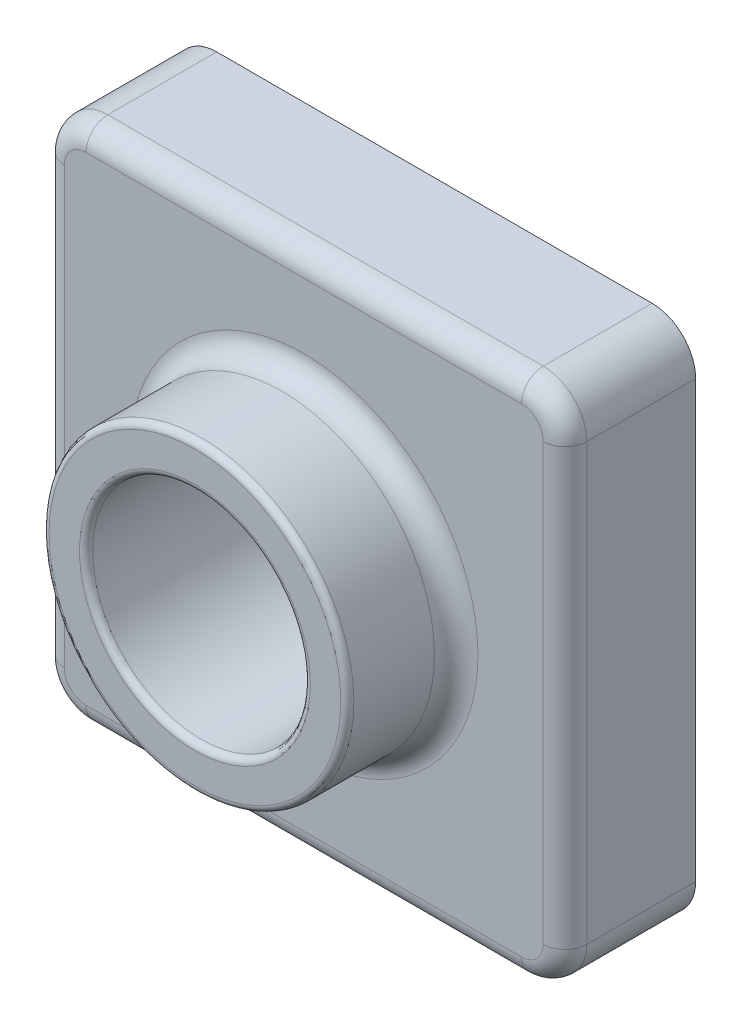
ISO-10303-21;
HEADER;
FILE_DESCRIPTION(('STEP AP214'),'2;1');
FILE_NAME('part.step','',(''),(''),'','','');
FILE_SCHEMA(('AUTOMOTIVE_DESIGN { 1 0 10303 214 1 1 1 1 }'));
ENDSEC;
DATA;
#1=APPLICATION_CONTEXT('core data for automotive mechanical design processes');
#2=APPLICATION_PROTOCOL_DEFINITION('international standard','automotive_design',2000,#1);
#3=PRODUCT_CONTEXT('',#1,'mechanical');
#4=PRODUCT('Part','Part','',(#3));
#5=PRODUCT_RELATED_PRODUCT_CATEGORY('part','',(#4));
#6=PRODUCT_DEFINITION_FORMATION('','',#4);
#7=PRODUCT_DEFINITION_CONTEXT('part definition',#1,'design');
#8=PRODUCT_DEFINITION('design','',#6,#7);
#9=PRODUCT_DEFINITION_SHAPE('','',#8);
#10=(LENGTH_UNIT() NAMED_UNIT(*) SI_UNIT(.MILLI.,.METRE.));
#11=(NAMED_UNIT(*) PLANE_ANGLE_UNIT() SI_UNIT($,.RADIAN.));
#12=(NAMED_UNIT(*) SI_UNIT($,.STERADIAN.) SOLID_ANGLE_UNIT());
#13=UNCERTAINTY_MEASURE_WITH_UNIT(LENGTH_MEASURE(1.E-05),#10,'distance_accuracy_value','');
#14=(GEOMETRIC_REPRESENTATION_CONTEXT(3) GLOBAL_UNCERTAINTY_ASSIGNED_CONTEXT((#13)) GLOBAL_UNIT_ASSIGNED_CONTEXT((#10,
#11,#12)) REPRESENTATION_CONTEXT('',''));
#15=CARTESIAN_POINT('',(0.,0.,0.));
#16=DIRECTION('',(0.,0.,1.));
#17=DIRECTION('',(1.,0.,0.));
#18=AXIS2_PLACEMENT_3D('',#15,#16,#17);
#19=CARTESIAN_POINT('',(0.,0.,0.));
#20=DIRECTION('',(0.,0.,-1.));
#21=DIRECTION('',(-1.,0.,0.));
#22=AXIS2_PLACEMENT_3D('',#19,#20,#21);
#23=PLANE('',#22);
#24=CARTESIAN_POINT('',(0.,0.,0.));
#25=DIRECTION('',(0.,0.,-1.));
#26=DIRECTION('',(-1.,0.,0.));
#27=AXIS2_PLACEMENT_3D('',#24,#25,#26);
#28=CIRCLE('',#27,27.);
#29=CARTESIAN_POINT('',(-27.,0.,0.));
#30=VERTEX_POINT('',#29);
#31=EDGE_CURVE('E264',#30,#30,#28,.F.);
#32=ORIENTED_EDGE('',*,*,#31,.F.);
#33=EDGE_LOOP('',(#32));
#34=FACE_BOUND('',#33,.T.);
#35=CARTESIAN_POINT('',(0.,0.,0.));
#36=DIRECTION('',(0.,0.,1.));
#37=DIRECTION('',(1.,0.,0.));
#38=AXIS2_PLACEMENT_3D('',#35,#36,#37);
#39=CIRCLE('',#38,25.);
#40=CARTESIAN_POINT('',(25.,0.,0.));
#41=VERTEX_POINT('',#40);
#42=EDGE_CURVE('E244',#41,#41,#39,.T.);
#43=ORIENTED_EDGE('',*,*,#42,.T.);
#44=EDGE_LOOP('',(#43));
#45=FACE_BOUND('',#44,.T.);
#46=ADVANCED_FACE('F40',(#34,#45),#23,.T.);
#47=CARTESIAN_POINT('',(-60.,-60.,30.));
#48=DIRECTION('',(-1.,0.,0.));
#49=DIRECTION('',(0.,0.,1.));
#50=AXIS2_PLACEMENT_3D('',#47,#48,#49);
#51=PLANE('',#50);
#52=DIRECTION('',(0.,0.,-1.));
#53=VECTOR('',#52,1.);
#54=CARTESIAN_POINT('',(-60.,-50.,30.));
#55=LINE('',#54,#53);
#56=CARTESIAN_POINT('',(-60.,-50.,0.));
#57=VERTEX_POINT('',#56);
#58=CARTESIAN_POINT('',(-60.,-50.,25.));
#59=VERTEX_POINT('',#58);
#60=EDGE_CURVE('E323',#57,#59,#55,.F.);
#61=ORIENTED_EDGE('',*,*,#60,.T.);
#62=DIRECTION('',(0.,1.,0.));
#63=VECTOR('',#62,1.);
#64=CARTESIAN_POINT('',(-60.,50.,25.));
#65=LINE('',#64,#63);
#66=CARTESIAN_POINT('',(-60.,50.,25.));
#67=VERTEX_POINT('',#66);
#68=EDGE_CURVE('E66',#59,#67,#65,.T.);
#69=ORIENTED_EDGE('',*,*,#68,.T.);
#70=DIRECTION('',(0.,0.,-1.));
#71=VECTOR('',#70,1.);
#72=CARTESIAN_POINT('',(-60.,50.,30.));
#73=LINE('',#72,#71);
#74=CARTESIAN_POINT('',(-60.,50.,0.));
#75=VERTEX_POINT('',#74);
#76=EDGE_CURVE('E326',#67,#75,#73,.T.);
#77=ORIENTED_EDGE('',*,*,#76,.T.);
#78=DIRECTION('',(0.,1.,0.));
#79=VECTOR('',#78,1.);
#80=CARTESIAN_POINT('',(-60.,-60.,0.));
#81=LINE('',#80,#79);
#82=EDGE_CURVE('E291',#57,#75,#81,.T.);
#83=ORIENTED_EDGE('',*,*,#82,.F.);
#84=EDGE_LOOP('',(#61,#69,#77,#83));
#85=FACE_BOUND('',#84,.T.);
#86=ADVANCED_FACE('F457',(#85),#51,.T.);
#87=CARTESIAN_POINT('',(-60.,-60.,30.));
#88=DIRECTION('',(0.,1.,0.));
#89=DIRECTION('',(0.,0.,1.));
#90=AXIS2_PLACEMENT_3D('',#87,#88,#89);
#91=PLANE('',#90);
#92=DIRECTION('',(0.,0.,-1.));
#93=VECTOR('',#92,1.);
#94=CARTESIAN_POINT('',(50.,-60.,30.));
#95=LINE('',#94,#93);
#96=CARTESIAN_POINT('',(50.,-60.,0.));
#97=VERTEX_POINT('',#96);
#98=CARTESIAN_POINT('',(50.,-60.,25.));
#99=VERTEX_POINT('',#98);
#100=EDGE_CURVE('E347',#97,#99,#95,.F.);
#101=ORIENTED_EDGE('',*,*,#100,.T.);
#102=DIRECTION('',(1.,0.,0.));
#103=VECTOR('',#102,1.);
#104=CARTESIAN_POINT('',(-60.,-60.,25.));
#105=LINE('',#104,#103);
#106=CARTESIAN_POINT('',(-50.,-60.,25.));
#107=VERTEX_POINT('',#106);
#108=EDGE_CURVE('E400',#99,#107,#105,.F.);
#109=ORIENTED_EDGE('',*,*,#108,.T.);
#110=DIRECTION('',(0.,0.,-1.));
#111=VECTOR('',#110,1.);
#112=CARTESIAN_POINT('',(-50.,-60.,0.));
#113=LINE('',#112,#111);
#114=CARTESIAN_POINT('',(-50.,-60.,0.));
#115=VERTEX_POINT('',#114);
#116=EDGE_CURVE('E351',#107,#115,#113,.T.);
#117=ORIENTED_EDGE('',*,*,#116,.T.);
#118=DIRECTION('',(1.,0.,0.));
#119=VECTOR('',#118,1.);
#120=CARTESIAN_POINT('',(-60.,-60.,0.));
#121=LINE('',#120,#119);
#122=EDGE_CURVE('E303',#115,#97,#121,.T.);
#123=ORIENTED_EDGE('',*,*,#122,.T.);
#124=EDGE_LOOP('',(#101,#109,#117,#123));
#125=FACE_BOUND('',#124,.T.);
#126=ADVANCED_FACE('F467',(#125),#91,.F.);
#127=CARTESIAN_POINT('',(60.,-60.,30.));
#128=DIRECTION('',(-1.,0.,0.));
#129=DIRECTION('',(0.,0.,1.));
#130=AXIS2_PLACEMENT_3D('',#127,#128,#129);
#131=PLANE('',#130);
#132=DIRECTION('',(0.,0.,-1.));
#133=VECTOR('',#132,1.);
#134=CARTESIAN_POINT('',(60.,50.,30.));
#135=LINE('',#134,#133);
#136=CARTESIAN_POINT('',(60.,50.,0.));
#137=VERTEX_POINT('',#136);
#138=CARTESIAN_POINT('',(60.,50.,25.));
#139=VERTEX_POINT('',#138);
#140=EDGE_CURVE('E354',#137,#139,#135,.F.);
#141=ORIENTED_EDGE('',*,*,#140,.T.);
#142=DIRECTION('',(0.,1.,0.));
#143=VECTOR('',#142,1.);
#144=CARTESIAN_POINT('',(60.,-60.,25.));
#145=LINE('',#144,#143);
#146=CARTESIAN_POINT('',(60.,-50.,25.));
#147=VERTEX_POINT('',#146);
#148=EDGE_CURVE('E394',#139,#147,#145,.F.);
#149=ORIENTED_EDGE('',*,*,#148,.T.);
#150=DIRECTION('',(0.,0.,-1.));
#151=VECTOR('',#150,1.);
#152=CARTESIAN_POINT('',(60.,-50.,30.));
#153=LINE('',#152,#151);
#154=CARTESIAN_POINT('',(60.,-50.,0.));
#155=VERTEX_POINT('',#154);
#156=EDGE_CURVE('E358',#147,#155,#153,.T.);
#157=ORIENTED_EDGE('',*,*,#156,.T.);
#158=DIRECTION('',(0.,1.,0.));
#159=VECTOR('',#158,1.);
#160=CARTESIAN_POINT('',(60.,-60.,0.));
#161=LINE('',#160,#159);
#162=EDGE_CURVE('E299',#155,#137,#161,.T.);
#163=ORIENTED_EDGE('',*,*,#162,.T.);
#164=EDGE_LOOP('',(#141,#149,#157,#163));
#165=FACE_BOUND('',#164,.T.);
#166=ADVANCED_FACE('F699',(#165),#131,.F.);
#167=CARTESIAN_POINT('',(-60.,60.,30.));
#168=DIRECTION('',(0.,1.,0.));
#169=DIRECTION('',(0.,0.,1.));
#170=AXIS2_PLACEMENT_3D('',#167,#168,#169);
#171=PLANE('',#170);
#172=DIRECTION('',(0.,0.,-1.));
#173=VECTOR('',#172,1.);
#174=CARTESIAN_POINT('',(-50.,60.,30.));
#175=LINE('',#174,#173);
#176=CARTESIAN_POINT('',(-50.,60.,0.));
#177=VERTEX_POINT('',#176);
#178=CARTESIAN_POINT('',(-50.,60.,25.));
#179=VERTEX_POINT('',#178);
#180=EDGE_CURVE('E344',#177,#179,#175,.F.);
#181=ORIENTED_EDGE('',*,*,#180,.T.);
#182=DIRECTION('',(1.,0.,0.));
#183=VECTOR('',#182,1.);
#184=CARTESIAN_POINT('',(50.,60.,25.));
#185=LINE('',#184,#183);
#186=CARTESIAN_POINT('',(50.,60.,25.));
#187=VERTEX_POINT('',#186);
#188=EDGE_CURVE('E50',#179,#187,#185,.T.);
#189=ORIENTED_EDGE('',*,*,#188,.T.);
#190=DIRECTION('',(0.,0.,-1.));
#191=VECTOR('',#190,1.);
#192=CARTESIAN_POINT('',(50.,60.,0.));
#193=LINE('',#192,#191);
#194=CARTESIAN_POINT('',(50.,60.,0.));
#195=VERTEX_POINT('',#194);
#196=EDGE_CURVE('E341',#187,#195,#193,.T.);
#197=ORIENTED_EDGE('',*,*,#196,.T.);
#198=DIRECTION('',(1.,0.,0.));
#199=VECTOR('',#198,1.);
#200=CARTESIAN_POINT('',(-60.,60.,0.));
#201=LINE('',#200,#199);
#202=EDGE_CURVE('E295',#177,#195,#201,.T.);
#203=ORIENTED_EDGE('',*,*,#202,.F.);
#204=EDGE_LOOP('',(#181,#189,#197,#203));
#205=FACE_BOUND('',#204,.T.);
#206=ADVANCED_FACE('F498',(#205),#171,.T.);
#207=CARTESIAN_POINT('',(0.,0.,30.));
#208=DIRECTION('',(0.,0.,-1.));
#209=DIRECTION('',(-1.,0.,0.));
#210=AXIS2_PLACEMENT_3D('',#207,#208,#209);
#211=PLANE('',#210);
#212=DIRECTION('',(0.,1.,0.));
#213=VECTOR('',#212,1.);
#214=CARTESIAN_POINT('',(55.,0.,30.));
#215=LINE('',#214,#213);
#216=CARTESIAN_POINT('',(55.,-50.,30.));
#217=VERTEX_POINT('',#216);
#218=CARTESIAN_POINT('',(55.,50.,30.));
#219=VERTEX_POINT('',#218);
#220=EDGE_CURVE('E383',#217,#219,#215,.T.);
#221=ORIENTED_EDGE('',*,*,#220,.T.);
#222=CARTESIAN_POINT('',(50.,50.,30.));
#223=DIRECTION('',(0.,0.,-1.));
#224=DIRECTION('',(-1.,0.,0.));
#225=AXIS2_PLACEMENT_3D('',#222,#223,#224);
#226=CIRCLE('',#225,5.);
#227=CARTESIAN_POINT('',(50.,55.,30.));
#228=VERTEX_POINT('',#227);
#229=EDGE_CURVE('E386',#219,#228,#226,.F.);
#230=ORIENTED_EDGE('',*,*,#229,.T.);
#231=DIRECTION('',(1.,0.,0.));
#232=VECTOR('',#231,1.);
#233=CARTESIAN_POINT('',(-50.,55.,30.));
#234=LINE('',#233,#232);
#235=CARTESIAN_POINT('',(-50.,55.,30.));
#236=VERTEX_POINT('',#235);
#237=EDGE_CURVE('E365',#228,#236,#234,.F.);
#238=ORIENTED_EDGE('',*,*,#237,.T.);
#239=CARTESIAN_POINT('',(-50.,50.,30.));
#240=DIRECTION('',(0.,0.,-1.));
#241=DIRECTION('',(-1.,0.,0.));
#242=AXIS2_PLACEMENT_3D('',#239,#240,#241);
#243=CIRCLE('',#242,5.);
#244=CARTESIAN_POINT('',(-55.,50.,30.));
#245=VERTEX_POINT('',#244);
#246=EDGE_CURVE('E368',#236,#245,#243,.F.);
#247=ORIENTED_EDGE('',*,*,#246,.T.);
#248=DIRECTION('',(0.,1.,0.));
#249=VECTOR('',#248,1.);
#250=CARTESIAN_POINT('',(-55.,-50.,30.));
#251=LINE('',#250,#249);
#252=CARTESIAN_POINT('',(-55.,-50.,30.));
#253=VERTEX_POINT('',#252);
#254=EDGE_CURVE('E371',#245,#253,#251,.F.);
#255=ORIENTED_EDGE('',*,*,#254,.T.);
#256=CARTESIAN_POINT('',(-50.,-50.,30.));
#257=DIRECTION('',(0.,0.,-1.));
#258=DIRECTION('',(-1.,0.,0.));
#259=AXIS2_PLACEMENT_3D('',#256,#257,#258);
#260=CIRCLE('',#259,5.);
#261=CARTESIAN_POINT('',(-50.,-55.,30.));
#262=VERTEX_POINT('',#261);
#263=EDGE_CURVE('E374',#253,#262,#260,.F.);
#264=ORIENTED_EDGE('',*,*,#263,.T.);
#265=DIRECTION('',(1.,0.,0.));
#266=VECTOR('',#265,1.);
#267=CARTESIAN_POINT('',(0.,-55.,30.));
#268=LINE('',#267,#266);
#269=CARTESIAN_POINT('',(50.,-55.,30.));
#270=VERTEX_POINT('',#269);
#271=EDGE_CURVE('E377',#262,#270,#268,.T.);
#272=ORIENTED_EDGE('',*,*,#271,.T.);
#273=CARTESIAN_POINT('',(50.,-50.,30.));
#274=DIRECTION('',(0.,0.,-1.));
#275=DIRECTION('',(-1.,0.,0.));
#276=AXIS2_PLACEMENT_3D('',#273,#274,#275);
#277=CIRCLE('',#276,5.);
#278=EDGE_CURVE('E380',#270,#217,#277,.F.);
#279=ORIENTED_EDGE('',*,*,#278,.T.);
#280=EDGE_LOOP('',(#221,#230,#238,#247,#255,#264,#272,#279));
#281=FACE_BOUND('',#280,.T.);
#282=CARTESIAN_POINT('',(0.,0.,30.));
#283=DIRECTION('',(0.,0.,-1.));
#284=DIRECTION('',(-1.,0.,0.));
#285=AXIS2_PLACEMENT_3D('',#282,#283,#284);
#286=CIRCLE('',#285,40.);
#287=CARTESIAN_POINT('',(-40.,0.,30.));
#288=VERTEX_POINT('',#287);
#289=EDGE_CURVE('E361',#288,#288,#286,.T.);
#290=ORIENTED_EDGE('',*,*,#289,.T.);
#291=EDGE_LOOP('',(#290));
#292=FACE_BOUND('',#291,.T.);
#293=ADVANCED_FACE('F483',(#281,#292),#211,.F.);
#294=DIRECTION('',(0.,1.,0.));
#295=VECTOR('',#294,1.);
#296=CARTESIAN_POINT('',(-58.,0.,0.));
#297=LINE('',#296,#295);
#298=CARTESIAN_POINT('',(-58.,-50.,0.));
#299=VERTEX_POINT('',#298);
#300=CARTESIAN_POINT('',(-58.,50.,0.));
#301=VERTEX_POINT('',#300);
#302=EDGE_CURVE('E260',#299,#301,#297,.T.);
#303=ORIENTED_EDGE('',*,*,#302,.F.);
#304=CARTESIAN_POINT('',(-50.,-50.,0.));
#305=DIRECTION('',(0.,0.,-1.));
#306=DIRECTION('',(-1.,0.,0.));
#307=AXIS2_PLACEMENT_3D('',#304,#305,#306);
#308=CIRCLE('',#307,8.);
#309=CARTESIAN_POINT('',(-50.,-58.,0.));
#310=VERTEX_POINT('',#309);
#311=EDGE_CURVE('E189',#310,#299,#308,.T.);
#312=ORIENTED_EDGE('',*,*,#311,.F.);
#313=DIRECTION('',(1.,0.,0.));
#314=VECTOR('',#313,1.);
#315=CARTESIAN_POINT('',(0.,-58.,0.));
#316=LINE('',#315,#314);
#317=CARTESIAN_POINT('',(49.9999999999999,-58.,0.));
#318=VERTEX_POINT('',#317);
#319=EDGE_CURVE('E205',#310,#318,#316,.T.);
#320=ORIENTED_EDGE('',*,*,#319,.T.);
#321=CARTESIAN_POINT('',(50.,-50.,0.));
#322=DIRECTION('',(0.,0.,-1.));
#323=DIRECTION('',(-1.,0.,0.));
#324=AXIS2_PLACEMENT_3D('',#321,#322,#323);
#325=CIRCLE('',#324,8.);
#326=CARTESIAN_POINT('',(58.,-50.,0.));
#327=VERTEX_POINT('',#326);
#328=EDGE_CURVE('E274',#327,#318,#325,.T.);
#329=ORIENTED_EDGE('',*,*,#328,.F.);
#330=DIRECTION('',(0.,1.,0.));
#331=VECTOR('',#330,1.);
#332=CARTESIAN_POINT('',(58.,0.,0.));
#333=LINE('',#332,#331);
#334=CARTESIAN_POINT('',(58.,50.,0.));
#335=VERTEX_POINT('',#334);
#336=EDGE_CURVE('E270',#327,#335,#333,.T.);
#337=ORIENTED_EDGE('',*,*,#336,.T.);
#338=CARTESIAN_POINT('',(50.,50.,0.));
#339=DIRECTION('',(0.,0.,-1.));
#340=DIRECTION('',(-1.,0.,0.));
#341=AXIS2_PLACEMENT_3D('',#338,#339,#340);
#342=CIRCLE('',#341,8.);
#343=CARTESIAN_POINT('',(50.,58.,0.));
#344=VERTEX_POINT('',#343);
#345=EDGE_CURVE('E271',#344,#335,#342,.T.);
#346=ORIENTED_EDGE('',*,*,#345,.F.);
#347=DIRECTION('',(1.,0.,0.));
#348=VECTOR('',#347,1.);
#349=CARTESIAN_POINT('',(0.,58.,0.));
#350=LINE('',#349,#348);
#351=CARTESIAN_POINT('',(-50.,58.,0.));
#352=VERTEX_POINT('',#351);
#353=EDGE_CURVE('E263',#352,#344,#350,.T.);
#354=ORIENTED_EDGE('',*,*,#353,.F.);
#355=CARTESIAN_POINT('',(-50.,50.,0.));
#356=DIRECTION('',(0.,0.,-1.));
#357=DIRECTION('',(-1.,0.,0.));
#358=AXIS2_PLACEMENT_3D('',#355,#356,#357);
#359=CIRCLE('',#358,8.);
#360=EDGE_CURVE('E250',#301,#352,#359,.T.);
#361=ORIENTED_EDGE('',*,*,#360,.F.);
#362=EDGE_LOOP('',(#303,#312,#320,#329,#337,#346,#354,#361));
#363=FACE_BOUND('',#362,.T.);
#364=ORIENTED_EDGE('',*,*,#82,.T.);
#365=CARTESIAN_POINT('',(-50.,50.,0.));
#366=DIRECTION('',(0.,0.,-1.));
#367=DIRECTION('',(-1.,0.,0.));
#368=AXIS2_PLACEMENT_3D('',#365,#366,#367);
#369=CIRCLE('',#368,10.);
#370=EDGE_CURVE('E338',#75,#177,#369,.T.);
#371=ORIENTED_EDGE('',*,*,#370,.T.);
#372=ORIENTED_EDGE('',*,*,#202,.T.);
#373=CARTESIAN_POINT('',(50.,50.,0.));
#374=DIRECTION('',(0.,0.,-1.));
#375=DIRECTION('',(-1.,0.,0.));
#376=AXIS2_PLACEMENT_3D('',#373,#374,#375);
#377=CIRCLE('',#376,10.);
#378=EDGE_CURVE('E329',#195,#137,#377,.T.);
#379=ORIENTED_EDGE('',*,*,#378,.T.);
#380=ORIENTED_EDGE('',*,*,#162,.F.);
#381=CARTESIAN_POINT('',(50.,-50.,0.));
#382=DIRECTION('',(0.,0.,-1.));
#383=DIRECTION('',(-1.,0.,0.));
#384=AXIS2_PLACEMENT_3D('',#381,#382,#383);
#385=CIRCLE('',#384,10.);
#386=EDGE_CURVE('E332',#155,#97,#385,.T.);
#387=ORIENTED_EDGE('',*,*,#386,.T.);
#388=ORIENTED_EDGE('',*,*,#122,.F.);
#389=CARTESIAN_POINT('',(-50.,-50.,0.));
#390=DIRECTION('',(0.,0.,-1.));
#391=DIRECTION('',(-1.,0.,0.));
#392=AXIS2_PLACEMENT_3D('',#389,#390,#391);
#393=CIRCLE('',#392,10.);
#394=EDGE_CURVE('E335',#115,#57,#393,.T.);
#395=ORIENTED_EDGE('',*,*,#394,.T.);
#396=EDGE_LOOP('',(#364,#371,#372,#379,#380,#387,#388,#395));
#397=FACE_BOUND('',#396,.T.);
#398=ADVANCED_FACE('F460',(#363,#397),#23,.T.);
#399=CARTESIAN_POINT('',(0.,0.,55.));
#400=DIRECTION('',(0.,0.,-1.));
#401=DIRECTION('',(-1.,0.,0.));
#402=AXIS2_PLACEMENT_3D('',#399,#400,#401);
#403=CYLINDRICAL_SURFACE('',#402,35.);
#404=CARTESIAN_POINT('',(0.,0.,35.));
#405=DIRECTION('',(0.,0.,-1.));
#406=DIRECTION('',(-1.,0.,0.));
#407=AXIS2_PLACEMENT_3D('',#404,#405,#406);
#408=CIRCLE('',#407,35.);
#409=CARTESIAN_POINT('',(-35.,0.,35.));
#410=VERTEX_POINT('',#409);
#411=EDGE_CURVE('E11',#410,#410,#408,.F.);
#412=ORIENTED_EDGE('',*,*,#411,.T.);
#413=EDGE_LOOP('',(#412));
#414=FACE_BOUND('',#413,.T.);
#415=CARTESIAN_POINT('',(0.,0.,53.5));
#416=DIRECTION('',(0.,0.,1.));
#417=DIRECTION('',(1.,0.,0.));
#418=AXIS2_PLACEMENT_3D('',#415,#416,#417);
#419=CIRCLE('',#418,35.);
#420=CARTESIAN_POINT('',(35.,0.,53.5));
#421=VERTEX_POINT('',#420);
#422=EDGE_CURVE('E315',#421,#421,#419,.F.);
#423=ORIENTED_EDGE('',*,*,#422,.T.);
#424=EDGE_LOOP('',(#423));
#425=FACE_BOUND('',#424,.T.);
#426=ADVANCED_FACE('F527',(#414,#425),#403,.T.);
#427=CARTESIAN_POINT('',(0.,0.,55.));
#428=DIRECTION('',(0.,0.,1.));
#429=DIRECTION('',(1.,0.,0.));
#430=AXIS2_PLACEMENT_3D('',#427,#428,#429);
#431=PLANE('',#430);
#432=CARTESIAN_POINT('',(0.,0.,55.));
#433=DIRECTION('',(0.,0.,1.));
#434=DIRECTION('',(1.,0.,0.));
#435=AXIS2_PLACEMENT_3D('',#432,#433,#434);
#436=CIRCLE('',#435,33.5);
#437=CARTESIAN_POINT('',(33.5,0.,55.));
#438=VERTEX_POINT('',#437);
#439=EDGE_CURVE('E311',#438,#438,#436,.T.);
#440=ORIENTED_EDGE('',*,*,#439,.T.);
#441=EDGE_LOOP('',(#440));
#442=FACE_BOUND('',#441,.T.);
#443=CARTESIAN_POINT('',(0.,0.,55.));
#444=DIRECTION('',(0.,0.,1.));
#445=DIRECTION('',(1.,0.,0.));
#446=AXIS2_PLACEMENT_3D('',#443,#444,#445);
#447=CIRCLE('',#446,26.5);
#448=CARTESIAN_POINT('',(26.5,0.,55.));
#449=VERTEX_POINT('',#448);
#450=EDGE_CURVE('E307',#449,#449,#447,.F.);
#451=ORIENTED_EDGE('',*,*,#450,.T.);
#452=EDGE_LOOP('',(#451));
#453=FACE_BOUND('',#452,.T.);
#454=ADVANCED_FACE('F533',(#442,#453),#431,.T.);
#455=CARTESIAN_POINT('',(0.,0.,0.));
#456=DIRECTION('',(0.,0.,1.));
#457=DIRECTION('',(1.,0.,0.));
#458=AXIS2_PLACEMENT_3D('',#455,#456,#457);
#459=CYLINDRICAL_SURFACE('',#458,25.);
#460=CARTESIAN_POINT('',(0.,0.,53.5));
#461=DIRECTION('',(0.,0.,1.));
#462=DIRECTION('',(1.,0.,0.));
#463=AXIS2_PLACEMENT_3D('',#460,#461,#462);
#464=CIRCLE('',#463,25.);
#465=CARTESIAN_POINT('',(25.,0.,53.5));
#466=VERTEX_POINT('',#465);
#467=EDGE_CURVE('E319',#466,#466,#464,.T.);
#468=ORIENTED_EDGE('',*,*,#467,.T.);
#469=EDGE_LOOP('',(#468));
#470=FACE_BOUND('',#469,.T.);
#471=ORIENTED_EDGE('',*,*,#42,.F.);
#472=EDGE_LOOP('',(#471));
#473=FACE_BOUND('',#472,.T.);
#474=ADVANCED_FACE('F586',(#470,#473),#459,.F.);
#475=CARTESIAN_POINT('',(0.,0.,53.5));
#476=DIRECTION('',(0.,0.,1.));
#477=DIRECTION('',(1.,0.,0.));
#478=AXIS2_PLACEMENT_3D('',#475,#476,#477);
#479=TOROIDAL_SURFACE('',#478,33.5,1.5);
#480=ORIENTED_EDGE('',*,*,#422,.F.);
#481=EDGE_LOOP('',(#480));
#482=FACE_BOUND('',#481,.T.);
#483=ORIENTED_EDGE('',*,*,#439,.F.);
#484=EDGE_LOOP('',(#483));
#485=FACE_BOUND('',#484,.T.);
#486=ADVANCED_FACE('F589',(#482,#485),#479,.T.);
#487=CARTESIAN_POINT('',(0.,0.,53.5));
#488=DIRECTION('',(0.,0.,1.));
#489=DIRECTION('',(1.,0.,0.));
#490=AXIS2_PLACEMENT_3D('',#487,#488,#489);
#491=TOROIDAL_SURFACE('',#490,26.5,1.5);
#492=ORIENTED_EDGE('',*,*,#450,.F.);
#493=EDGE_LOOP('',(#492));
#494=FACE_BOUND('',#493,.T.);
#495=ORIENTED_EDGE('',*,*,#467,.F.);
#496=EDGE_LOOP('',(#495));
#497=FACE_BOUND('',#496,.T.);
#498=ADVANCED_FACE('F599',(#494,#497),#491,.T.);
#499=CARTESIAN_POINT('',(-50.,50.,30.));
#500=DIRECTION('',(0.,0.,-1.));
#501=DIRECTION('',(-1.,0.,0.));
#502=AXIS2_PLACEMENT_3D('',#499,#500,#501);
#503=CYLINDRICAL_SURFACE('',#502,10.);
#504=ORIENTED_EDGE('',*,*,#76,.F.);
#505=CARTESIAN_POINT('',(-50.,50.,25.));
#506=DIRECTION('',(0.,0.,-1.));
#507=DIRECTION('',(-1.,0.,0.));
#508=AXIS2_PLACEMENT_3D('',#505,#506,#507);
#509=CIRCLE('',#508,10.);
#510=EDGE_CURVE('E58',#67,#179,#509,.T.);
#511=ORIENTED_EDGE('',*,*,#510,.T.);
#512=ORIENTED_EDGE('',*,*,#180,.F.);
#513=ORIENTED_EDGE('',*,*,#370,.F.);
#514=EDGE_LOOP('',(#504,#511,#512,#513));
#515=FACE_BOUND('',#514,.T.);
#516=ADVANCED_FACE('F602',(#515),#503,.T.);
#517=CARTESIAN_POINT('',(-50.,-50.,30.));
#518=DIRECTION('',(0.,0.,1.));
#519=DIRECTION('',(1.,0.,0.));
#520=AXIS2_PLACEMENT_3D('',#517,#518,#519);
#521=CYLINDRICAL_SURFACE('',#520,10.);
#522=ORIENTED_EDGE('',*,*,#116,.F.);
#523=CARTESIAN_POINT('',(-50.,-50.,25.));
#524=DIRECTION('',(0.,0.,-1.));
#525=DIRECTION('',(-1.,0.,0.));
#526=AXIS2_PLACEMENT_3D('',#523,#524,#525);
#527=CIRCLE('',#526,10.);
#528=EDGE_CURVE('E403',#107,#59,#527,.T.);
#529=ORIENTED_EDGE('',*,*,#528,.T.);
#530=ORIENTED_EDGE('',*,*,#60,.F.);
#531=ORIENTED_EDGE('',*,*,#394,.F.);
#532=EDGE_LOOP('',(#522,#529,#530,#531));
#533=FACE_BOUND('',#532,.T.);
#534=ADVANCED_FACE('F454',(#533),#521,.T.);
#535=CARTESIAN_POINT('',(50.,-50.,30.));
#536=DIRECTION('',(0.,0.,-1.));
#537=DIRECTION('',(-1.,0.,0.));
#538=AXIS2_PLACEMENT_3D('',#535,#536,#537);
#539=CYLINDRICAL_SURFACE('',#538,10.);
#540=ORIENTED_EDGE('',*,*,#156,.F.);
#541=CARTESIAN_POINT('',(50.,-50.,25.));
#542=DIRECTION('',(0.,0.,-1.));
#543=DIRECTION('',(-1.,0.,0.));
#544=AXIS2_PLACEMENT_3D('',#541,#542,#543);
#545=CIRCLE('',#544,10.);
#546=EDGE_CURVE('E397',#147,#99,#545,.T.);
#547=ORIENTED_EDGE('',*,*,#546,.T.);
#548=ORIENTED_EDGE('',*,*,#100,.F.);
#549=ORIENTED_EDGE('',*,*,#386,.F.);
#550=EDGE_LOOP('',(#540,#547,#548,#549));
#551=FACE_BOUND('',#550,.T.);
#552=ADVANCED_FACE('F470',(#551),#539,.T.);
#553=CARTESIAN_POINT('',(50.,50.,30.));
#554=DIRECTION('',(0.,0.,1.));
#555=DIRECTION('',(1.,0.,0.));
#556=AXIS2_PLACEMENT_3D('',#553,#554,#555);
#557=CYLINDRICAL_SURFACE('',#556,10.);
#558=ORIENTED_EDGE('',*,*,#196,.F.);
#559=CARTESIAN_POINT('',(50.,50.,25.));
#560=DIRECTION('',(0.,0.,-1.));
#561=DIRECTION('',(-1.,0.,0.));
#562=AXIS2_PLACEMENT_3D('',#559,#560,#561);
#563=CIRCLE('',#562,10.);
#564=EDGE_CURVE('E390',#187,#139,#563,.T.);
#565=ORIENTED_EDGE('',*,*,#564,.T.);
#566=ORIENTED_EDGE('',*,*,#140,.F.);
#567=ORIENTED_EDGE('',*,*,#378,.F.);
#568=EDGE_LOOP('',(#558,#565,#566,#567));
#569=FACE_BOUND('',#568,.T.);
#570=ADVANCED_FACE('F502',(#569),#557,.T.);
#571=CARTESIAN_POINT('',(-58.,-60.,30.));
#572=DIRECTION('',(-1.,0.,0.));
#573=DIRECTION('',(0.,0.,1.));
#574=AXIS2_PLACEMENT_3D('',#571,#572,#573);
#575=PLANE('',#574);
#576=DIRECTION('',(0.,1.,0.));
#577=VECTOR('',#576,1.);
#578=CARTESIAN_POINT('',(-58.,0.,28.));
#579=LINE('',#578,#577);
#580=CARTESIAN_POINT('',(-58.,-50.,28.));
#581=VERTEX_POINT('',#580);
#582=CARTESIAN_POINT('',(-58.,50.,28.));
#583=VERTEX_POINT('',#582);
#584=EDGE_CURVE('E199',#581,#583,#579,.T.);
#585=ORIENTED_EDGE('',*,*,#584,.F.);
#586=DIRECTION('',(0.,0.,1.));
#587=VECTOR('',#586,1.);
#588=CARTESIAN_POINT('',(-58.,-50.,30.));
#589=LINE('',#588,#587);
#590=EDGE_CURVE('E181',#299,#581,#589,.T.);
#591=ORIENTED_EDGE('',*,*,#590,.F.);
#592=ORIENTED_EDGE('',*,*,#302,.T.);
#593=DIRECTION('',(0.,0.,1.));
#594=VECTOR('',#593,1.);
#595=CARTESIAN_POINT('',(-58.,50.,30.));
#596=LINE('',#595,#594);
#597=EDGE_CURVE('E194',#583,#301,#596,.F.);
#598=ORIENTED_EDGE('',*,*,#597,.F.);
#599=EDGE_LOOP('',(#585,#591,#592,#598));
#600=FACE_BOUND('',#599,.T.);
#601=ADVANCED_FACE('F200',(#600),#575,.F.);
#602=CARTESIAN_POINT('',(-60.,-58.,30.));
#603=DIRECTION('',(0.,1.,0.));
#604=DIRECTION('',(0.,0.,1.));
#605=AXIS2_PLACEMENT_3D('',#602,#603,#604);
#606=PLANE('',#605);
#607=DIRECTION('',(1.,0.,0.));
#608=VECTOR('',#607,1.);
#609=CARTESIAN_POINT('',(0.,-58.,28.));
#610=LINE('',#609,#608);
#611=CARTESIAN_POINT('',(-50.,-58.,28.));
#612=VERTEX_POINT('',#611);
#613=CARTESIAN_POINT('',(49.9999999999999,-58.,28.));
#614=VERTEX_POINT('',#613);
#615=EDGE_CURVE('E211',#612,#614,#610,.T.);
#616=ORIENTED_EDGE('',*,*,#615,.T.);
#617=DIRECTION('',(0.,0.,1.));
#618=VECTOR('',#617,1.);
#619=CARTESIAN_POINT('',(49.9999999999999,-58.,30.));
#620=LINE('',#619,#618);
#621=EDGE_CURVE('E219',#318,#614,#620,.T.);
#622=ORIENTED_EDGE('',*,*,#621,.F.);
#623=ORIENTED_EDGE('',*,*,#319,.F.);
#624=DIRECTION('',(0.,0.,1.));
#625=VECTOR('',#624,1.);
#626=CARTESIAN_POINT('',(-50.,-58.,30.));
#627=LINE('',#626,#625);
#628=EDGE_CURVE('E235',#612,#310,#627,.F.);
#629=ORIENTED_EDGE('',*,*,#628,.F.);
#630=EDGE_LOOP('',(#616,#622,#623,#629));
#631=FACE_BOUND('',#630,.T.);
#632=ADVANCED_FACE('F622',(#631),#606,.T.);
#633=CARTESIAN_POINT('',(58.,-60.,30.));
#634=DIRECTION('',(-1.,0.,0.));
#635=DIRECTION('',(0.,0.,1.));
#636=AXIS2_PLACEMENT_3D('',#633,#634,#635);
#637=PLANE('',#636);
#638=DIRECTION('',(0.,1.,0.));
#639=VECTOR('',#638,1.);
#640=CARTESIAN_POINT('',(58.,0.,28.));
#641=LINE('',#640,#639);
#642=CARTESIAN_POINT('',(58.,-50.,28.));
#643=VERTEX_POINT('',#642);
#644=CARTESIAN_POINT('',(58.,50.,28.));
#645=VERTEX_POINT('',#644);
#646=EDGE_CURVE('E227',#643,#645,#641,.T.);
#647=ORIENTED_EDGE('',*,*,#646,.T.);
#648=DIRECTION('',(0.,0.,1.));
#649=VECTOR('',#648,1.);
#650=CARTESIAN_POINT('',(58.,50.,30.));
#651=LINE('',#650,#649);
#652=EDGE_CURVE('E238',#335,#645,#651,.T.);
#653=ORIENTED_EDGE('',*,*,#652,.F.);
#654=ORIENTED_EDGE('',*,*,#336,.F.);
#655=DIRECTION('',(0.,0.,1.));
#656=VECTOR('',#655,1.);
#657=CARTESIAN_POINT('',(58.,-50.,30.));
#658=LINE('',#657,#656);
#659=EDGE_CURVE('E241',#643,#327,#658,.F.);
#660=ORIENTED_EDGE('',*,*,#659,.F.);
#661=EDGE_LOOP('',(#647,#653,#654,#660));
#662=FACE_BOUND('',#661,.T.);
#663=ADVANCED_FACE('F627',(#662),#637,.T.);
#664=CARTESIAN_POINT('',(-60.,58.,30.));
#665=DIRECTION('',(0.,1.,0.));
#666=DIRECTION('',(0.,0.,1.));
#667=AXIS2_PLACEMENT_3D('',#664,#665,#666);
#668=PLANE('',#667);
#669=ORIENTED_EDGE('',*,*,#353,.T.);
#670=DIRECTION('',(0.,0.,1.));
#671=VECTOR('',#670,1.);
#672=CARTESIAN_POINT('',(49.9999999999999,58.,30.));
#673=LINE('',#672,#671);
#674=CARTESIAN_POINT('',(49.9999999999999,58.,28.));
#675=VERTEX_POINT('',#674);
#676=EDGE_CURVE('E247',#675,#344,#673,.F.);
#677=ORIENTED_EDGE('',*,*,#676,.F.);
#678=DIRECTION('',(1.,0.,0.));
#679=VECTOR('',#678,1.);
#680=CARTESIAN_POINT('',(0.,58.,28.));
#681=LINE('',#680,#679);
#682=CARTESIAN_POINT('',(-50.,58.,28.));
#683=VERTEX_POINT('',#682);
#684=EDGE_CURVE('E204',#683,#675,#681,.T.);
#685=ORIENTED_EDGE('',*,*,#684,.F.);
#686=DIRECTION('',(0.,0.,1.));
#687=VECTOR('',#686,1.);
#688=CARTESIAN_POINT('',(-50.,58.,30.));
#689=LINE('',#688,#687);
#690=EDGE_CURVE('E234',#352,#683,#689,.T.);
#691=ORIENTED_EDGE('',*,*,#690,.F.);
#692=EDGE_LOOP('',(#669,#677,#685,#691));
#693=FACE_BOUND('',#692,.T.);
#694=ADVANCED_FACE('F544',(#693),#668,.F.);
#695=CARTESIAN_POINT('',(0.,0.,28.));
#696=DIRECTION('',(0.,0.,-1.));
#697=DIRECTION('',(-1.,0.,0.));
#698=AXIS2_PLACEMENT_3D('',#695,#696,#697);
#699=PLANE('',#698);
#700=CARTESIAN_POINT('',(0.,0.,28.));
#701=DIRECTION('',(0.,0.,-1.));
#702=DIRECTION('',(-1.,0.,0.));
#703=AXIS2_PLACEMENT_3D('',#700,#701,#702);
#704=CIRCLE('',#703,33.);
#705=CARTESIAN_POINT('',(-33.,0.,28.));
#706=VERTEX_POINT('',#705);
#707=EDGE_CURVE('E226',#706,#706,#704,.F.);
#708=ORIENTED_EDGE('',*,*,#707,.T.);
#709=EDGE_LOOP('',(#708));
#710=FACE_BOUND('',#709,.T.);
#711=ORIENTED_EDGE('',*,*,#684,.T.);
#712=CARTESIAN_POINT('',(50.,50.,28.));
#713=DIRECTION('',(0.,0.,-1.));
#714=DIRECTION('',(-1.,0.,0.));
#715=AXIS2_PLACEMENT_3D('',#712,#713,#714);
#716=CIRCLE('',#715,8.);
#717=EDGE_CURVE('E221',#645,#675,#716,.F.);
#718=ORIENTED_EDGE('',*,*,#717,.F.);
#719=ORIENTED_EDGE('',*,*,#646,.F.);
#720=CARTESIAN_POINT('',(50.,-50.,28.));
#721=DIRECTION('',(0.,0.,-1.));
#722=DIRECTION('',(-1.,0.,0.));
#723=AXIS2_PLACEMENT_3D('',#720,#721,#722);
#724=CIRCLE('',#723,8.);
#725=EDGE_CURVE('E215',#614,#643,#724,.F.);
#726=ORIENTED_EDGE('',*,*,#725,.F.);
#727=ORIENTED_EDGE('',*,*,#615,.F.);
#728=CARTESIAN_POINT('',(-50.,-50.,28.));
#729=DIRECTION('',(0.,0.,-1.));
#730=DIRECTION('',(-1.,0.,0.));
#731=AXIS2_PLACEMENT_3D('',#728,#729,#730);
#732=CIRCLE('',#731,8.);
#733=EDGE_CURVE('E186',#581,#612,#732,.F.);
#734=ORIENTED_EDGE('',*,*,#733,.F.);
#735=ORIENTED_EDGE('',*,*,#584,.T.);
#736=CARTESIAN_POINT('',(-50.,50.,28.));
#737=DIRECTION('',(0.,0.,-1.));
#738=DIRECTION('',(-1.,0.,0.));
#739=AXIS2_PLACEMENT_3D('',#736,#737,#738);
#740=CIRCLE('',#739,8.);
#741=EDGE_CURVE('E214',#683,#583,#740,.F.);
#742=ORIENTED_EDGE('',*,*,#741,.F.);
#743=EDGE_LOOP('',(#711,#718,#719,#726,#727,#734,#735,#742));
#744=FACE_BOUND('',#743,.T.);
#745=ADVANCED_FACE('F208',(#710,#744),#699,.T.);
#746=CARTESIAN_POINT('',(0.,0.,55.));
#747=DIRECTION('',(0.,0.,-1.));
#748=DIRECTION('',(-1.,0.,0.));
#749=AXIS2_PLACEMENT_3D('',#746,#747,#748);
#750=CYLINDRICAL_SURFACE('',#749,33.);
#751=CARTESIAN_POINT('',(0.,0.,53.));
#752=DIRECTION('',(0.,0.,1.));
#753=DIRECTION('',(1.,0.,0.));
#754=AXIS2_PLACEMENT_3D('',#751,#752,#753);
#755=CIRCLE('',#754,33.);
#756=CARTESIAN_POINT('',(33.,0.,53.));
#757=VERTEX_POINT('',#756);
#758=EDGE_CURVE('E253',#757,#757,#755,.T.);
#759=ORIENTED_EDGE('',*,*,#758,.T.);
#760=EDGE_LOOP('',(#759));
#761=FACE_BOUND('',#760,.T.);
#762=ORIENTED_EDGE('',*,*,#707,.F.);
#763=EDGE_LOOP('',(#762));
#764=FACE_BOUND('',#763,.T.);
#765=ADVANCED_FACE('F556',(#761,#764),#750,.F.);
#766=CARTESIAN_POINT('',(0.,0.,53.));
#767=DIRECTION('',(0.,0.,1.));
#768=DIRECTION('',(1.,0.,0.));
#769=AXIS2_PLACEMENT_3D('',#766,#767,#768);
#770=PLANE('',#769);
#771=ORIENTED_EDGE('',*,*,#758,.F.);
#772=EDGE_LOOP('',(#771));
#773=FACE_BOUND('',#772,.T.);
#774=CARTESIAN_POINT('',(0.,0.,53.));
#775=DIRECTION('',(0.,0.,1.));
#776=DIRECTION('',(1.,0.,0.));
#777=AXIS2_PLACEMENT_3D('',#774,#775,#776);
#778=CIRCLE('',#777,27.);
#779=CARTESIAN_POINT('',(27.,0.,53.));
#780=VERTEX_POINT('',#779);
#781=EDGE_CURVE('E195',#780,#780,#778,.T.);
#782=ORIENTED_EDGE('',*,*,#781,.T.);
#783=EDGE_LOOP('',(#782));
#784=FACE_BOUND('',#783,.T.);
#785=ADVANCED_FACE('F558',(#773,#784),#770,.F.);
#786=CARTESIAN_POINT('',(0.,0.,0.));
#787=DIRECTION('',(0.,0.,1.));
#788=DIRECTION('',(1.,0.,0.));
#789=AXIS2_PLACEMENT_3D('',#786,#787,#788);
#790=CYLINDRICAL_SURFACE('',#789,27.);
#791=ORIENTED_EDGE('',*,*,#781,.F.);
#792=EDGE_LOOP('',(#791));
#793=FACE_BOUND('',#792,.T.);
#794=ORIENTED_EDGE('',*,*,#31,.T.);
#795=EDGE_LOOP('',(#794));
#796=FACE_BOUND('',#795,.T.);
#797=ADVANCED_FACE('F565',(#793,#796),#790,.T.);
#798=CARTESIAN_POINT('',(-50.,50.,30.));
#799=DIRECTION('',(0.,0.,-1.));
#800=DIRECTION('',(-1.,0.,0.));
#801=AXIS2_PLACEMENT_3D('',#798,#799,#800);
#802=CYLINDRICAL_SURFACE('',#801,8.);
#803=ORIENTED_EDGE('',*,*,#741,.T.);
#804=ORIENTED_EDGE('',*,*,#597,.T.);
#805=ORIENTED_EDGE('',*,*,#360,.T.);
#806=ORIENTED_EDGE('',*,*,#690,.T.);
#807=EDGE_LOOP('',(#803,#804,#805,#806));
#808=FACE_BOUND('',#807,.T.);
#809=ADVANCED_FACE('F541',(#808),#802,.F.);
#810=CARTESIAN_POINT('',(-50.,-50.,30.));
#811=DIRECTION('',(0.,0.,1.));
#812=DIRECTION('',(1.,0.,0.));
#813=AXIS2_PLACEMENT_3D('',#810,#811,#812);
#814=CYLINDRICAL_SURFACE('',#813,8.);
#815=ORIENTED_EDGE('',*,*,#733,.T.);
#816=ORIENTED_EDGE('',*,*,#628,.T.);
#817=ORIENTED_EDGE('',*,*,#311,.T.);
#818=ORIENTED_EDGE('',*,*,#590,.T.);
#819=EDGE_LOOP('',(#815,#816,#817,#818));
#820=FACE_BOUND('',#819,.T.);
#821=ADVANCED_FACE('F183',(#820),#814,.F.);
#822=CARTESIAN_POINT('',(50.,-50.,30.));
#823=DIRECTION('',(0.,0.,-1.));
#824=DIRECTION('',(-1.,0.,0.));
#825=AXIS2_PLACEMENT_3D('',#822,#823,#824);
#826=CYLINDRICAL_SURFACE('',#825,8.);
#827=ORIENTED_EDGE('',*,*,#725,.T.);
#828=ORIENTED_EDGE('',*,*,#659,.T.);
#829=ORIENTED_EDGE('',*,*,#328,.T.);
#830=ORIENTED_EDGE('',*,*,#621,.T.);
#831=EDGE_LOOP('',(#827,#828,#829,#830));
#832=FACE_BOUND('',#831,.T.);
#833=ADVANCED_FACE('F578',(#832),#826,.F.);
#834=CARTESIAN_POINT('',(50.,50.,30.));
#835=DIRECTION('',(0.,0.,1.));
#836=DIRECTION('',(1.,0.,0.));
#837=AXIS2_PLACEMENT_3D('',#834,#835,#836);
#838=CYLINDRICAL_SURFACE('',#837,8.);
#839=ORIENTED_EDGE('',*,*,#717,.T.);
#840=ORIENTED_EDGE('',*,*,#676,.T.);
#841=ORIENTED_EDGE('',*,*,#345,.T.);
#842=ORIENTED_EDGE('',*,*,#652,.T.);
#843=EDGE_LOOP('',(#839,#840,#841,#842));
#844=FACE_BOUND('',#843,.T.);
#845=ADVANCED_FACE('F581',(#844),#838,.F.);
#846=CARTESIAN_POINT('',(-50.,-50.,25.));
#847=DIRECTION('',(0.,0.,-1.));
#848=DIRECTION('',(-1.,0.,0.));
#849=AXIS2_PLACEMENT_3D('',#846,#847,#848);
#850=DEGENERATE_TOROIDAL_SURFACE('',#849,5.,5.,.T.);
#851=CARTESIAN_POINT('',(-55.,-50.,25.));
#852=DIRECTION('',(0.,1.,0.));
#853=DIRECTION('',(0.,0.,1.));
#854=AXIS2_PLACEMENT_3D('',#851,#852,#853);
#855=CIRCLE('',#854,5.);
#856=EDGE_CURVE('E433',#59,#253,#855,.T.);
#857=ORIENTED_EDGE('',*,*,#856,.F.);
#858=ORIENTED_EDGE('',*,*,#528,.F.);
#859=CARTESIAN_POINT('',(-50.,-55.,25.));
#860=DIRECTION('',(1.,0.,0.));
#861=DIRECTION('',(0.,0.,-1.));
#862=AXIS2_PLACEMENT_3D('',#859,#860,#861);
#863=CIRCLE('',#862,5.);
#864=EDGE_CURVE('E44',#262,#107,#863,.T.);
#865=ORIENTED_EDGE('',*,*,#864,.F.);
#866=ORIENTED_EDGE('',*,*,#263,.F.);
#867=EDGE_LOOP('',(#857,#858,#865,#866));
#868=FACE_BOUND('',#867,.T.);
#869=ADVANCED_FACE('F450',(#868),#850,.T.);
#870=CARTESIAN_POINT('',(0.,-55.,25.));
#871=DIRECTION('',(1.,0.,0.));
#872=DIRECTION('',(0.,0.,-1.));
#873=AXIS2_PLACEMENT_3D('',#870,#871,#872);
#874=CYLINDRICAL_SURFACE('',#873,5.);
#875=ORIENTED_EDGE('',*,*,#864,.T.);
#876=ORIENTED_EDGE('',*,*,#108,.F.);
#877=CARTESIAN_POINT('',(50.,-55.,25.));
#878=DIRECTION('',(1.,0.,0.));
#879=DIRECTION('',(0.,1.,0.));
#880=AXIS2_PLACEMENT_3D('',#877,#878,#879);
#881=CIRCLE('',#880,5.);
#882=EDGE_CURVE('E430',#270,#99,#881,.T.);
#883=ORIENTED_EDGE('',*,*,#882,.F.);
#884=ORIENTED_EDGE('',*,*,#271,.F.);
#885=EDGE_LOOP('',(#875,#876,#883,#884));
#886=FACE_BOUND('',#885,.T.);
#887=ADVANCED_FACE('F445',(#886),#874,.T.);
#888=CARTESIAN_POINT('',(-55.,-60.,25.));
#889=DIRECTION('',(0.,-1.,0.));
#890=DIRECTION('',(0.,0.,-1.));
#891=AXIS2_PLACEMENT_3D('',#888,#889,#890);
#892=CYLINDRICAL_SURFACE('',#891,5.);
#893=ORIENTED_EDGE('',*,*,#856,.T.);
#894=ORIENTED_EDGE('',*,*,#254,.F.);
#895=CARTESIAN_POINT('',(-55.,50.,25.));
#896=DIRECTION('',(0.,1.,0.));
#897=DIRECTION('',(0.,0.,1.));
#898=AXIS2_PLACEMENT_3D('',#895,#896,#897);
#899=CIRCLE('',#898,5.);
#900=EDGE_CURVE('E426',#67,#245,#899,.T.);
#901=ORIENTED_EDGE('',*,*,#900,.F.);
#902=ORIENTED_EDGE('',*,*,#68,.F.);
#903=EDGE_LOOP('',(#893,#894,#901,#902));
#904=FACE_BOUND('',#903,.T.);
#905=ADVANCED_FACE('F487',(#904),#892,.T.);
#906=CARTESIAN_POINT('',(50.,-50.,25.));
#907=DIRECTION('',(0.,0.,-1.));
#908=DIRECTION('',(-1.,0.,0.));
#909=AXIS2_PLACEMENT_3D('',#906,#907,#908);
#910=DEGENERATE_TOROIDAL_SURFACE('',#909,5.,5.,.T.);
#911=ORIENTED_EDGE('',*,*,#882,.T.);
#912=ORIENTED_EDGE('',*,*,#546,.F.);
#913=CARTESIAN_POINT('',(55.,-50.,25.));
#914=DIRECTION('',(0.,1.,0.));
#915=DIRECTION('',(0.,0.,1.));
#916=AXIS2_PLACEMENT_3D('',#913,#914,#915);
#917=CIRCLE('',#916,5.);
#918=EDGE_CURVE('E422',#217,#147,#917,.T.);
#919=ORIENTED_EDGE('',*,*,#918,.F.);
#920=ORIENTED_EDGE('',*,*,#278,.F.);
#921=EDGE_LOOP('',(#911,#912,#919,#920));
#922=FACE_BOUND('',#921,.T.);
#923=ADVANCED_FACE('F474',(#922),#910,.T.);
#924=CARTESIAN_POINT('',(-50.,50.,25.));
#925=DIRECTION('',(0.,0.,-1.));
#926=DIRECTION('',(-1.,0.,0.));
#927=AXIS2_PLACEMENT_3D('',#924,#925,#926);
#928=DEGENERATE_TOROIDAL_SURFACE('',#927,5.,5.,.T.);
#929=ORIENTED_EDGE('',*,*,#900,.T.);
#930=ORIENTED_EDGE('',*,*,#246,.F.);
#931=CARTESIAN_POINT('',(-50.,55.,25.));
#932=DIRECTION('',(1.,0.,0.));
#933=DIRECTION('',(0.,0.,-1.));
#934=AXIS2_PLACEMENT_3D('',#931,#932,#933);
#935=CIRCLE('',#934,5.);
#936=EDGE_CURVE('E418',#179,#236,#935,.T.);
#937=ORIENTED_EDGE('',*,*,#936,.F.);
#938=ORIENTED_EDGE('',*,*,#510,.F.);
#939=EDGE_LOOP('',(#929,#930,#937,#938));
#940=FACE_BOUND('',#939,.T.);
#941=ADVANCED_FACE('F489',(#940),#928,.T.);
#942=CARTESIAN_POINT('',(55.,0.,25.));
#943=DIRECTION('',(0.,1.,0.));
#944=DIRECTION('',(0.,0.,1.));
#945=AXIS2_PLACEMENT_3D('',#942,#943,#944);
#946=CYLINDRICAL_SURFACE('',#945,5.);
#947=ORIENTED_EDGE('',*,*,#918,.T.);
#948=ORIENTED_EDGE('',*,*,#148,.F.);
#949=CARTESIAN_POINT('',(55.,50.,25.));
#950=DIRECTION('',(0.,1.,0.));
#951=DIRECTION('',(0.,0.,1.));
#952=AXIS2_PLACEMENT_3D('',#949,#950,#951);
#953=CIRCLE('',#952,5.);
#954=EDGE_CURVE('E415',#219,#139,#953,.T.);
#955=ORIENTED_EDGE('',*,*,#954,.F.);
#956=ORIENTED_EDGE('',*,*,#220,.F.);
#957=EDGE_LOOP('',(#947,#948,#955,#956));
#958=FACE_BOUND('',#957,.T.);
#959=ADVANCED_FACE('F479',(#958),#946,.T.);
#960=CARTESIAN_POINT('',(-60.,55.,25.));
#961=DIRECTION('',(-1.,0.,0.));
#962=DIRECTION('',(0.,0.,1.));
#963=AXIS2_PLACEMENT_3D('',#960,#961,#962);
#964=CYLINDRICAL_SURFACE('',#963,5.);
#965=ORIENTED_EDGE('',*,*,#936,.T.);
#966=ORIENTED_EDGE('',*,*,#237,.F.);
#967=CARTESIAN_POINT('',(50.,55.,25.));
#968=DIRECTION('',(1.,0.,0.));
#969=DIRECTION('',(0.,0.,-1.));
#970=AXIS2_PLACEMENT_3D('',#967,#968,#969);
#971=CIRCLE('',#970,5.);
#972=EDGE_CURVE('E412',#187,#228,#971,.T.);
#973=ORIENTED_EDGE('',*,*,#972,.F.);
#974=ORIENTED_EDGE('',*,*,#188,.F.);
#975=EDGE_LOOP('',(#965,#966,#973,#974));
#976=FACE_BOUND('',#975,.T.);
#977=ADVANCED_FACE('F495',(#976),#964,.T.);
#978=CARTESIAN_POINT('',(50.,50.,25.));
#979=DIRECTION('',(0.,0.,-1.));
#980=DIRECTION('',(-1.,0.,0.));
#981=AXIS2_PLACEMENT_3D('',#978,#979,#980);
#982=DEGENERATE_TOROIDAL_SURFACE('',#981,5.,5.,.T.);
#983=ORIENTED_EDGE('',*,*,#954,.T.);
#984=ORIENTED_EDGE('',*,*,#564,.F.);
#985=ORIENTED_EDGE('',*,*,#972,.T.);
#986=ORIENTED_EDGE('',*,*,#229,.F.);
#987=EDGE_LOOP('',(#983,#984,#985,#986));
#988=FACE_BOUND('',#987,.T.);
#989=ADVANCED_FACE('F505',(#988),#982,.T.);
#990=CARTESIAN_POINT('',(0.,0.,35.));
#991=DIRECTION('',(0.,0.,-1.));
#992=DIRECTION('',(-1.,0.,0.));
#993=AXIS2_PLACEMENT_3D('',#990,#991,#992);
#994=TOROIDAL_SURFACE('',#993,40.,5.);
#995=ORIENTED_EDGE('',*,*,#289,.F.);
#996=EDGE_LOOP('',(#995));
#997=FACE_BOUND('',#996,.T.);
#998=ORIENTED_EDGE('',*,*,#411,.F.);
#999=EDGE_LOOP('',(#998));
#1000=FACE_BOUND('',#999,.T.);
#1001=ADVANCED_FACE('F42',(#997,#1000),#994,.F.);
#1002=CLOSED_SHELL('',(#46,#86,#126,#166,#206,#293,#398,#426,#454,#474,#486,#498,#516,#534,#552,
#570,#601,#632,#663,#694,#745,#765,#785,#797,#809,#821,#833,#845,#869,#887,#905,#923,#941,#959,
#977,#989,#1001));
#1003=MANIFOLD_SOLID_BREP('B2',#1002);
#1004=ADVANCED_BREP_SHAPE_REPRESENTATION('',(#18,#1003),#14);
#1005=SHAPE_DEFINITION_REPRESENTATION(#9,#1004);
ENDSEC;
END-ISO-10303-21;
